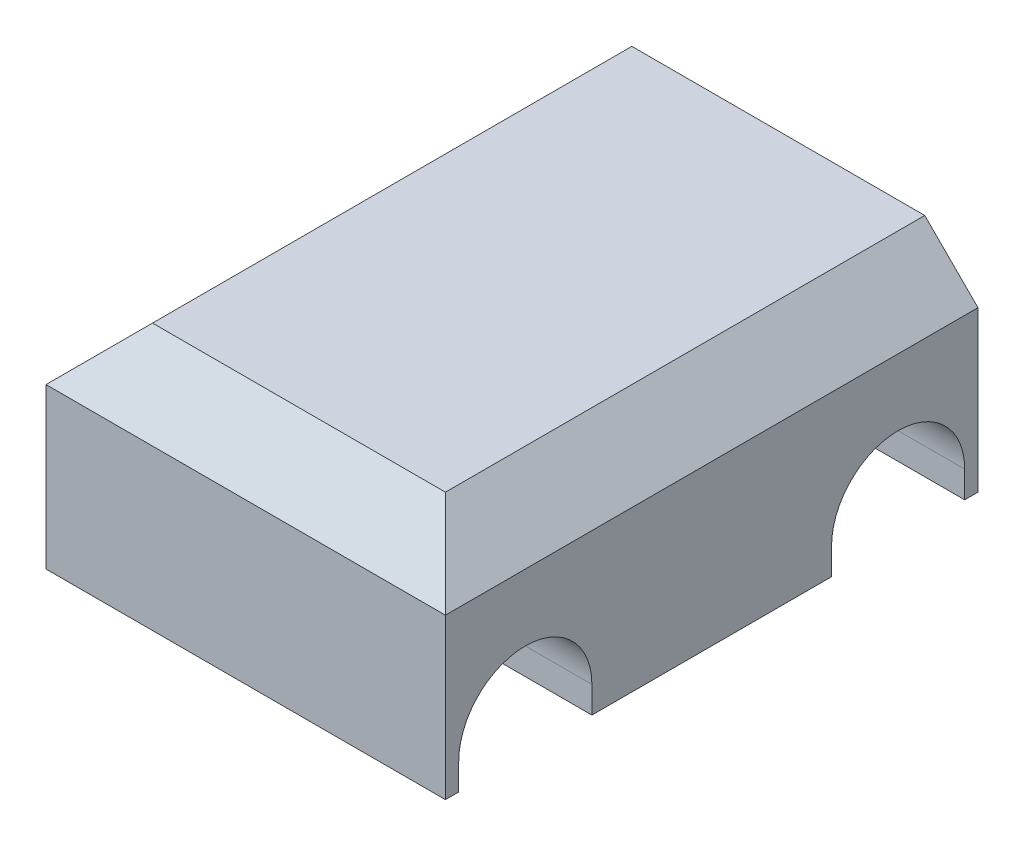
ISO-10303-21;
HEADER;
FILE_DESCRIPTION(('STEP AP214'),'2;1');
FILE_NAME('part.step','',(''),(''),'','','');
FILE_SCHEMA(('AUTOMOTIVE_DESIGN { 1 0 10303 214 1 1 1 1 }'));
ENDSEC;
DATA;
#1=APPLICATION_CONTEXT('core data for automotive mechanical design processes');
#2=APPLICATION_PROTOCOL_DEFINITION('international standard','automotive_design',2000,#1);
#3=PRODUCT_CONTEXT('',#1,'mechanical');
#4=PRODUCT('Part','Part','',(#3));
#5=PRODUCT_RELATED_PRODUCT_CATEGORY('part','',(#4));
#6=PRODUCT_DEFINITION_FORMATION('','',#4);
#7=PRODUCT_DEFINITION_CONTEXT('part definition',#1,'design');
#8=PRODUCT_DEFINITION('design','',#6,#7);
#9=PRODUCT_DEFINITION_SHAPE('','',#8);
#10=(LENGTH_UNIT() NAMED_UNIT(*) SI_UNIT(.MILLI.,.METRE.));
#11=(NAMED_UNIT(*) PLANE_ANGLE_UNIT() SI_UNIT($,.RADIAN.));
#12=(NAMED_UNIT(*) SI_UNIT($,.STERADIAN.) SOLID_ANGLE_UNIT());
#13=UNCERTAINTY_MEASURE_WITH_UNIT(LENGTH_MEASURE(1.E-05),#10,'distance_accuracy_value','');
#14=(GEOMETRIC_REPRESENTATION_CONTEXT(3) GLOBAL_UNCERTAINTY_ASSIGNED_CONTEXT((#13)) GLOBAL_UNIT_ASSIGNED_CONTEXT((#10,
#11,#12)) REPRESENTATION_CONTEXT('',''));
#15=CARTESIAN_POINT('',(0.,0.,0.));
#16=DIRECTION('',(0.,0.,1.));
#17=DIRECTION('',(1.,0.,0.));
#18=AXIS2_PLACEMENT_3D('',#15,#16,#17);
#19=CARTESIAN_POINT('',(0.,0.,0.));
#20=DIRECTION('',(0.,1.,0.));
#21=DIRECTION('',(0.,0.,1.));
#22=AXIS2_PLACEMENT_3D('',#19,#20,#21);
#23=PLANE('',#22);
#24=DIRECTION('',(1.,0.,0.));
#25=VECTOR('',#24,1.);
#26=CARTESIAN_POINT('',(0.,0.,45.));
#27=LINE('',#26,#25);
#28=CARTESIAN_POINT('',(40.,0.,45.));
#29=VERTEX_POINT('',#28);
#30=CARTESIAN_POINT('',(75.,0.,45.));
#31=VERTEX_POINT('',#30);
#32=EDGE_CURVE('E218',#29,#31,#27,.T.);
#33=ORIENTED_EDGE('',*,*,#32,.F.);
#34=DIRECTION('',(0.,0.,-1.));
#35=VECTOR('',#34,1.);
#36=CARTESIAN_POINT('',(40.,0.,0.));
#37=LINE('',#36,#35);
#38=CARTESIAN_POINT('',(40.,0.,95.));
#39=VERTEX_POINT('',#38);
#40=EDGE_CURVE('E202',#39,#29,#37,.T.);
#41=ORIENTED_EDGE('',*,*,#40,.F.);
#42=DIRECTION('',(1.,0.,0.));
#43=VECTOR('',#42,1.);
#44=CARTESIAN_POINT('',(0.,0.,95.));
#45=LINE('',#44,#43);
#46=CARTESIAN_POINT('',(75.,0.,95.));
#47=VERTEX_POINT('',#46);
#48=EDGE_CURVE('E214',#39,#47,#45,.T.);
#49=ORIENTED_EDGE('',*,*,#48,.T.);
#50=DIRECTION('',(0.,0.,-1.));
#51=VECTOR('',#50,1.);
#52=CARTESIAN_POINT('',(75.,0.,-100.));
#53=LINE('',#52,#51);
#54=CARTESIAN_POINT('',(75.,0.,100.));
#55=VERTEX_POINT('',#54);
#56=EDGE_CURVE('E291',#55,#47,#53,.T.);
#57=ORIENTED_EDGE('',*,*,#56,.F.);
#58=DIRECTION('',(1.,0.,0.));
#59=VECTOR('',#58,1.);
#60=CARTESIAN_POINT('',(-75.,0.,100.));
#61=LINE('',#60,#59);
#62=CARTESIAN_POINT('',(-75.,0.,100.));
#63=VERTEX_POINT('',#62);
#64=EDGE_CURVE('E290',#63,#55,#61,.T.);
#65=ORIENTED_EDGE('',*,*,#64,.F.);
#66=DIRECTION('',(0.,0.,1.));
#67=VECTOR('',#66,1.);
#68=CARTESIAN_POINT('',(-75.,0.,-100.));
#69=LINE('',#68,#67);
#70=CARTESIAN_POINT('',(-75.,0.,95.));
#71=VERTEX_POINT('',#70);
#72=EDGE_CURVE('E298',#71,#63,#69,.T.);
#73=ORIENTED_EDGE('',*,*,#72,.F.);
#74=DIRECTION('',(-1.,0.,0.));
#75=VECTOR('',#74,1.);
#76=CARTESIAN_POINT('',(0.,0.,95.));
#77=LINE('',#76,#75);
#78=CARTESIAN_POINT('',(-40.,0.,95.));
#79=VERTEX_POINT('',#78);
#80=EDGE_CURVE('E321',#79,#71,#77,.T.);
#81=ORIENTED_EDGE('',*,*,#80,.F.);
#82=DIRECTION('',(0.,0.,1.));
#83=VECTOR('',#82,1.);
#84=CARTESIAN_POINT('',(-40.,0.,0.));
#85=LINE('',#84,#83);
#86=CARTESIAN_POINT('',(-40.,0.,45.));
#87=VERTEX_POINT('',#86);
#88=EDGE_CURVE('E319',#87,#79,#85,.T.);
#89=ORIENTED_EDGE('',*,*,#88,.F.);
#90=DIRECTION('',(-1.,0.,0.));
#91=VECTOR('',#90,1.);
#92=CARTESIAN_POINT('',(0.,0.,45.));
#93=LINE('',#92,#91);
#94=CARTESIAN_POINT('',(-75.,0.,45.));
#95=VERTEX_POINT('',#94);
#96=EDGE_CURVE('E323',#87,#95,#93,.T.);
#97=ORIENTED_EDGE('',*,*,#96,.T.);
#98=CARTESIAN_POINT('',(-75.,0.,-45.));
#99=VERTEX_POINT('',#98);
#100=EDGE_CURVE('E302',#99,#95,#69,.T.);
#101=ORIENTED_EDGE('',*,*,#100,.F.);
#102=DIRECTION('',(-1.,0.,0.));
#103=VECTOR('',#102,1.);
#104=CARTESIAN_POINT('',(0.,0.,-45.));
#105=LINE('',#104,#103);
#106=CARTESIAN_POINT('',(-40.,0.,-45.));
#107=VERTEX_POINT('',#106);
#108=EDGE_CURVE('E317',#107,#99,#105,.T.);
#109=ORIENTED_EDGE('',*,*,#108,.F.);
#110=DIRECTION('',(0.,0.,1.));
#111=VECTOR('',#110,1.);
#112=CARTESIAN_POINT('',(-40.,0.,0.));
#113=LINE('',#112,#111);
#114=CARTESIAN_POINT('',(-40.,0.,-95.));
#115=VERTEX_POINT('',#114);
#116=EDGE_CURVE('E312',#115,#107,#113,.T.);
#117=ORIENTED_EDGE('',*,*,#116,.F.);
#118=DIRECTION('',(-1.,0.,0.));
#119=VECTOR('',#118,1.);
#120=CARTESIAN_POINT('',(0.,0.,-95.));
#121=LINE('',#120,#119);
#122=CARTESIAN_POINT('',(-75.,0.,-95.));
#123=VERTEX_POINT('',#122);
#124=EDGE_CURVE('E314',#115,#123,#121,.T.);
#125=ORIENTED_EDGE('',*,*,#124,.T.);
#126=CARTESIAN_POINT('',(-75.,0.,-100.));
#127=VERTEX_POINT('',#126);
#128=EDGE_CURVE('E299',#127,#123,#69,.T.);
#129=ORIENTED_EDGE('',*,*,#128,.F.);
#130=DIRECTION('',(-1.,0.,0.));
#131=VECTOR('',#130,1.);
#132=CARTESIAN_POINT('',(-75.,0.,-100.));
#133=LINE('',#132,#131);
#134=CARTESIAN_POINT('',(75.,0.,-100.));
#135=VERTEX_POINT('',#134);
#136=EDGE_CURVE('E294',#135,#127,#133,.T.);
#137=ORIENTED_EDGE('',*,*,#136,.F.);
#138=CARTESIAN_POINT('',(75.,0.,-95.));
#139=VERTEX_POINT('',#138);
#140=EDGE_CURVE('E284',#139,#135,#53,.T.);
#141=ORIENTED_EDGE('',*,*,#140,.F.);
#142=DIRECTION('',(1.,0.,0.));
#143=VECTOR('',#142,1.);
#144=CARTESIAN_POINT('',(0.,0.,-95.));
#145=LINE('',#144,#143);
#146=CARTESIAN_POINT('',(40.,0.,-95.));
#147=VERTEX_POINT('',#146);
#148=EDGE_CURVE('E240',#147,#139,#145,.T.);
#149=ORIENTED_EDGE('',*,*,#148,.F.);
#150=DIRECTION('',(0.,0.,-1.));
#151=VECTOR('',#150,1.);
#152=CARTESIAN_POINT('',(40.,0.,0.));
#153=LINE('',#152,#151);
#154=CARTESIAN_POINT('',(40.,0.,-45.));
#155=VERTEX_POINT('',#154);
#156=EDGE_CURVE('E326',#155,#147,#153,.T.);
#157=ORIENTED_EDGE('',*,*,#156,.F.);
#158=DIRECTION('',(1.,0.,0.));
#159=VECTOR('',#158,1.);
#160=CARTESIAN_POINT('',(0.,0.,-45.));
#161=LINE('',#160,#159);
#162=CARTESIAN_POINT('',(75.,0.,-45.));
#163=VERTEX_POINT('',#162);
#164=EDGE_CURVE('E243',#155,#163,#161,.T.);
#165=ORIENTED_EDGE('',*,*,#164,.T.);
#166=EDGE_CURVE('E295',#31,#163,#53,.T.);
#167=ORIENTED_EDGE('',*,*,#166,.F.);
#168=EDGE_LOOP('',(#33,#41,#49,#57,#65,#73,#81,#89,#97,#101,#109,#117,#125,#129,#137,#141,#149,
#157,#165,#167));
#169=FACE_BOUND('',#168,.T.);
#170=ADVANCED_FACE('F32',(#169),#23,.F.);
#171=CARTESIAN_POINT('',(75.,80.,-100.));
#172=DIRECTION('',(-1.,0.,0.));
#173=DIRECTION('',(0.,0.,1.));
#174=AXIS2_PLACEMENT_3D('',#171,#172,#173);
#175=PLANE('',#174);
#176=DIRECTION('',(0.,-1.,0.));
#177=VECTOR('',#176,1.);
#178=CARTESIAN_POINT('',(75.,80.,-100.));
#179=LINE('',#178,#177);
#180=CARTESIAN_POINT('',(75.,59.9999999999999,-100.));
#181=VERTEX_POINT('',#180);
#182=EDGE_CURVE('E310',#181,#135,#179,.T.);
#183=ORIENTED_EDGE('',*,*,#182,.F.);
#184=DIRECTION('',(0.,0.,1.));
#185=VECTOR('',#184,1.);
#186=CARTESIAN_POINT('',(75.,59.9999999999999,100.));
#187=LINE('',#186,#185);
#188=CARTESIAN_POINT('',(75.,59.9999999999999,100.));
#189=VERTEX_POINT('',#188);
#190=EDGE_CURVE('E56',#181,#189,#187,.T.);
#191=ORIENTED_EDGE('',*,*,#190,.T.);
#192=DIRECTION('',(0.,-1.,0.));
#193=VECTOR('',#192,1.);
#194=CARTESIAN_POINT('',(75.,80.,100.));
#195=LINE('',#194,#193);
#196=EDGE_CURVE('E289',#189,#55,#195,.T.);
#197=ORIENTED_EDGE('',*,*,#196,.T.);
#198=ORIENTED_EDGE('',*,*,#56,.T.);
#199=DIRECTION('',(0.,-1.,0.));
#200=VECTOR('',#199,1.);
#201=CARTESIAN_POINT('',(75.,0.,95.));
#202=LINE('',#201,#200);
#203=CARTESIAN_POINT('',(75.,10.,95.));
#204=VERTEX_POINT('',#203);
#205=EDGE_CURVE('E203',#204,#47,#202,.T.);
#206=ORIENTED_EDGE('',*,*,#205,.F.);
#207=CARTESIAN_POINT('',(75.,10.,70.));
#208=DIRECTION('',(1.,0.,0.));
#209=DIRECTION('',(0.,0.,-1.));
#210=AXIS2_PLACEMENT_3D('',#207,#208,#209);
#211=CIRCLE('',#210,25.);
#212=CARTESIAN_POINT('',(75.,10.,45.));
#213=VERTEX_POINT('',#212);
#214=EDGE_CURVE('E211',#213,#204,#211,.T.);
#215=ORIENTED_EDGE('',*,*,#214,.F.);
#216=DIRECTION('',(0.,-1.,0.));
#217=VECTOR('',#216,1.);
#218=CARTESIAN_POINT('',(75.,0.,45.));
#219=LINE('',#218,#217);
#220=EDGE_CURVE('E188',#213,#31,#219,.T.);
#221=ORIENTED_EDGE('',*,*,#220,.T.);
#222=ORIENTED_EDGE('',*,*,#166,.T.);
#223=DIRECTION('',(0.,-1.,0.));
#224=VECTOR('',#223,1.);
#225=CARTESIAN_POINT('',(75.,0.,-45.));
#226=LINE('',#225,#224);
#227=CARTESIAN_POINT('',(75.,10.,-45.));
#228=VERTEX_POINT('',#227);
#229=EDGE_CURVE('E220',#228,#163,#226,.T.);
#230=ORIENTED_EDGE('',*,*,#229,.F.);
#231=CARTESIAN_POINT('',(75.,10.,-70.));
#232=DIRECTION('',(-1.,0.,0.));
#233=DIRECTION('',(0.,0.,1.));
#234=AXIS2_PLACEMENT_3D('',#231,#232,#233);
#235=CIRCLE('',#234,25.);
#236=CARTESIAN_POINT('',(75.,10.,-95.));
#237=VERTEX_POINT('',#236);
#238=EDGE_CURVE('E225',#228,#237,#235,.T.);
#239=ORIENTED_EDGE('',*,*,#238,.T.);
#240=DIRECTION('',(0.,-1.,0.));
#241=VECTOR('',#240,1.);
#242=CARTESIAN_POINT('',(75.,0.,-95.));
#243=LINE('',#242,#241);
#244=EDGE_CURVE('E233',#237,#139,#243,.T.);
#245=ORIENTED_EDGE('',*,*,#244,.T.);
#246=ORIENTED_EDGE('',*,*,#140,.T.);
#247=EDGE_LOOP('',(#183,#191,#197,#198,#206,#215,#221,#222,#230,#239,#245,#246));
#248=FACE_BOUND('',#247,.T.);
#249=ADVANCED_FACE('F393',(#248),#175,.F.);
#250=CARTESIAN_POINT('',(-75.,80.,-100.));
#251=DIRECTION('',(1.,0.,0.));
#252=DIRECTION('',(0.,0.,-1.));
#253=AXIS2_PLACEMENT_3D('',#250,#251,#252);
#254=PLANE('',#253);
#255=DIRECTION('',(0.,-1.,0.));
#256=VECTOR('',#255,1.);
#257=CARTESIAN_POINT('',(-75.,80.,100.));
#258=LINE('',#257,#256);
#259=CARTESIAN_POINT('',(-75.,59.9999999999999,100.));
#260=VERTEX_POINT('',#259);
#261=EDGE_CURVE('E306',#260,#63,#258,.T.);
#262=ORIENTED_EDGE('',*,*,#261,.F.);
#263=DIRECTION('',(0.,0.,-1.));
#264=VECTOR('',#263,1.);
#265=CARTESIAN_POINT('',(-75.,59.9999999999999,-100.));
#266=LINE('',#265,#264);
#267=CARTESIAN_POINT('',(-75.,59.9999999999999,-100.));
#268=VERTEX_POINT('',#267);
#269=EDGE_CURVE('E11',#260,#268,#266,.T.);
#270=ORIENTED_EDGE('',*,*,#269,.T.);
#271=DIRECTION('',(0.,-1.,0.));
#272=VECTOR('',#271,1.);
#273=CARTESIAN_POINT('',(-75.,80.,-100.));
#274=LINE('',#273,#272);
#275=EDGE_CURVE('E308',#268,#127,#274,.T.);
#276=ORIENTED_EDGE('',*,*,#275,.T.);
#277=ORIENTED_EDGE('',*,*,#128,.T.);
#278=DIRECTION('',(0.,-1.,0.));
#279=VECTOR('',#278,1.);
#280=CARTESIAN_POINT('',(-75.,0.,-95.));
#281=LINE('',#280,#279);
#282=CARTESIAN_POINT('',(-75.,10.,-95.));
#283=VERTEX_POINT('',#282);
#284=EDGE_CURVE('E270',#283,#123,#281,.T.);
#285=ORIENTED_EDGE('',*,*,#284,.F.);
#286=CARTESIAN_POINT('',(-75.,10.,-70.));
#287=DIRECTION('',(-1.,0.,0.));
#288=DIRECTION('',(0.,0.,1.));
#289=AXIS2_PLACEMENT_3D('',#286,#287,#288);
#290=CIRCLE('',#289,25.);
#291=CARTESIAN_POINT('',(-75.,10.,-45.));
#292=VERTEX_POINT('',#291);
#293=EDGE_CURVE('E278',#292,#283,#290,.T.);
#294=ORIENTED_EDGE('',*,*,#293,.F.);
#295=DIRECTION('',(0.,-1.,0.));
#296=VECTOR('',#295,1.);
#297=CARTESIAN_POINT('',(-75.,0.,-45.));
#298=LINE('',#297,#296);
#299=EDGE_CURVE('E264',#292,#99,#298,.T.);
#300=ORIENTED_EDGE('',*,*,#299,.T.);
#301=ORIENTED_EDGE('',*,*,#100,.T.);
#302=DIRECTION('',(0.,-1.,0.));
#303=VECTOR('',#302,1.);
#304=CARTESIAN_POINT('',(-75.,0.,45.));
#305=LINE('',#304,#303);
#306=CARTESIAN_POINT('',(-75.,10.,45.));
#307=VERTEX_POINT('',#306);
#308=EDGE_CURVE('E246',#307,#95,#305,.T.);
#309=ORIENTED_EDGE('',*,*,#308,.F.);
#310=CARTESIAN_POINT('',(-75.,10.,70.));
#311=DIRECTION('',(1.,0.,0.));
#312=DIRECTION('',(0.,0.,-1.));
#313=AXIS2_PLACEMENT_3D('',#310,#311,#312);
#314=CIRCLE('',#313,25.);
#315=CARTESIAN_POINT('',(-75.,10.,95.));
#316=VERTEX_POINT('',#315);
#317=EDGE_CURVE('E250',#307,#316,#314,.T.);
#318=ORIENTED_EDGE('',*,*,#317,.T.);
#319=DIRECTION('',(0.,-1.,0.));
#320=VECTOR('',#319,1.);
#321=CARTESIAN_POINT('',(-75.,0.,95.));
#322=LINE('',#321,#320);
#323=EDGE_CURVE('E257',#316,#71,#322,.T.);
#324=ORIENTED_EDGE('',*,*,#323,.T.);
#325=ORIENTED_EDGE('',*,*,#72,.T.);
#326=EDGE_LOOP('',(#262,#270,#276,#277,#285,#294,#300,#301,#309,#318,#324,#325));
#327=FACE_BOUND('',#326,.T.);
#328=ADVANCED_FACE('F357',(#327),#254,.F.);
#329=CARTESIAN_POINT('',(-75.,80.,-100.));
#330=DIRECTION('',(0.,0.,1.));
#331=DIRECTION('',(1.,0.,0.));
#332=AXIS2_PLACEMENT_3D('',#329,#330,#331);
#333=PLANE('',#332);
#334=DIRECTION('',(-1.,0.,0.));
#335=VECTOR('',#334,1.);
#336=CARTESIAN_POINT('',(-75.,80.,-100.));
#337=LINE('',#336,#335);
#338=CARTESIAN_POINT('',(54.9999999999999,80.,-100.));
#339=VERTEX_POINT('',#338);
#340=CARTESIAN_POINT('',(-55.,80.,-100.));
#341=VERTEX_POINT('',#340);
#342=EDGE_CURVE('E286',#339,#341,#337,.T.);
#343=ORIENTED_EDGE('',*,*,#342,.F.);
#344=DIRECTION('',(0.707106781186546,-0.707106781186549,0.));
#345=VECTOR('',#344,1.);
#346=CARTESIAN_POINT('',(54.9999999999999,80.,-100.));
#347=LINE('',#346,#345);
#348=EDGE_CURVE('E338',#339,#181,#347,.T.);
#349=ORIENTED_EDGE('',*,*,#348,.T.);
#350=ORIENTED_EDGE('',*,*,#182,.T.);
#351=ORIENTED_EDGE('',*,*,#136,.T.);
#352=ORIENTED_EDGE('',*,*,#275,.F.);
#353=DIRECTION('',(0.707106781186546,0.707106781186549,0.));
#354=VECTOR('',#353,1.);
#355=CARTESIAN_POINT('',(-55.,80.,-100.));
#356=LINE('',#355,#354);
#357=EDGE_CURVE('E336',#268,#341,#356,.T.);
#358=ORIENTED_EDGE('',*,*,#357,.T.);
#359=EDGE_LOOP('',(#343,#349,#350,#351,#352,#358));
#360=FACE_BOUND('',#359,.T.);
#361=ADVANCED_FACE('F361',(#360),#333,.F.);
#362=CARTESIAN_POINT('',(-75.,80.,100.));
#363=DIRECTION('',(0.,0.,-1.));
#364=DIRECTION('',(-1.,0.,0.));
#365=AXIS2_PLACEMENT_3D('',#362,#363,#364);
#366=PLANE('',#365);
#367=ORIENTED_EDGE('',*,*,#196,.F.);
#368=DIRECTION('',(-1.,0.,0.));
#369=VECTOR('',#368,1.);
#370=CARTESIAN_POINT('',(-75.,59.9999999999999,100.));
#371=LINE('',#370,#369);
#372=EDGE_CURVE('E41',#189,#260,#371,.T.);
#373=ORIENTED_EDGE('',*,*,#372,.T.);
#374=ORIENTED_EDGE('',*,*,#261,.T.);
#375=ORIENTED_EDGE('',*,*,#64,.T.);
#376=EDGE_LOOP('',(#367,#373,#374,#375));
#377=FACE_BOUND('',#376,.T.);
#378=ADVANCED_FACE('F392',(#377),#366,.F.);
#379=CARTESIAN_POINT('',(0.,80.,0.));
#380=DIRECTION('',(0.,1.,0.));
#381=DIRECTION('',(0.,0.,1.));
#382=AXIS2_PLACEMENT_3D('',#379,#380,#381);
#383=PLANE('',#382);
#384=DIRECTION('',(1.,0.,0.));
#385=VECTOR('',#384,1.);
#386=CARTESIAN_POINT('',(75.,80.,80.));
#387=LINE('',#386,#385);
#388=CARTESIAN_POINT('',(-55.,80.,80.));
#389=VERTEX_POINT('',#388);
#390=CARTESIAN_POINT('',(54.9999999999999,80.,80.));
#391=VERTEX_POINT('',#390);
#392=EDGE_CURVE('E331',#389,#391,#387,.T.);
#393=ORIENTED_EDGE('',*,*,#392,.T.);
#394=DIRECTION('',(0.,0.,-1.));
#395=VECTOR('',#394,1.);
#396=CARTESIAN_POINT('',(54.9999999999999,80.,-100.));
#397=LINE('',#396,#395);
#398=EDGE_CURVE('E333',#391,#339,#397,.T.);
#399=ORIENTED_EDGE('',*,*,#398,.T.);
#400=ORIENTED_EDGE('',*,*,#342,.T.);
#401=DIRECTION('',(0.,0.,1.));
#402=VECTOR('',#401,1.);
#403=CARTESIAN_POINT('',(-55.,80.,100.));
#404=LINE('',#403,#402);
#405=EDGE_CURVE('E329',#341,#389,#404,.T.);
#406=ORIENTED_EDGE('',*,*,#405,.T.);
#407=EDGE_LOOP('',(#393,#399,#400,#406));
#408=FACE_BOUND('',#407,.T.);
#409=ADVANCED_FACE('F417',(#408),#383,.T.);
#410=CARTESIAN_POINT('',(-40.,0.,-45.));
#411=DIRECTION('',(0.,0.,-1.));
#412=DIRECTION('',(-1.,0.,0.));
#413=AXIS2_PLACEMENT_3D('',#410,#411,#412);
#414=PLANE('',#413);
#415=ORIENTED_EDGE('',*,*,#108,.T.);
#416=ORIENTED_EDGE('',*,*,#299,.F.);
#417=DIRECTION('',(-1.,0.,0.));
#418=VECTOR('',#417,1.);
#419=CARTESIAN_POINT('',(-40.,10.,-45.));
#420=LINE('',#419,#418);
#421=CARTESIAN_POINT('',(-40.,10.,-45.));
#422=VERTEX_POINT('',#421);
#423=EDGE_CURVE('E275',#422,#292,#420,.T.);
#424=ORIENTED_EDGE('',*,*,#423,.F.);
#425=DIRECTION('',(0.,-1.,0.));
#426=VECTOR('',#425,1.);
#427=CARTESIAN_POINT('',(-40.,0.,-45.));
#428=LINE('',#427,#426);
#429=EDGE_CURVE('E266',#422,#107,#428,.T.);
#430=ORIENTED_EDGE('',*,*,#429,.T.);
#431=EDGE_LOOP('',(#415,#416,#424,#430));
#432=FACE_BOUND('',#431,.T.);
#433=ADVANCED_FACE('F380',(#432),#414,.T.);
#434=CARTESIAN_POINT('',(-40.,0.,-95.));
#435=DIRECTION('',(0.,0.,-1.));
#436=DIRECTION('',(-1.,0.,0.));
#437=AXIS2_PLACEMENT_3D('',#434,#435,#436);
#438=PLANE('',#437);
#439=DIRECTION('',(0.,-1.,0.));
#440=VECTOR('',#439,1.);
#441=CARTESIAN_POINT('',(-40.,0.,-95.));
#442=LINE('',#441,#440);
#443=CARTESIAN_POINT('',(-40.,10.,-95.));
#444=VERTEX_POINT('',#443);
#445=EDGE_CURVE('E273',#444,#115,#442,.T.);
#446=ORIENTED_EDGE('',*,*,#445,.F.);
#447=DIRECTION('',(-1.,0.,0.));
#448=VECTOR('',#447,1.);
#449=CARTESIAN_POINT('',(-40.,10.,-95.));
#450=LINE('',#449,#448);
#451=EDGE_CURVE('E282',#444,#283,#450,.T.);
#452=ORIENTED_EDGE('',*,*,#451,.T.);
#453=ORIENTED_EDGE('',*,*,#284,.T.);
#454=ORIENTED_EDGE('',*,*,#124,.F.);
#455=EDGE_LOOP('',(#446,#452,#453,#454));
#456=FACE_BOUND('',#455,.T.);
#457=ADVANCED_FACE('F373',(#456),#438,.F.);
#458=CARTESIAN_POINT('',(-40.,0.,0.));
#459=DIRECTION('',(-1.,0.,0.));
#460=DIRECTION('',(0.,0.,1.));
#461=AXIS2_PLACEMENT_3D('',#458,#459,#460);
#462=PLANE('',#461);
#463=ORIENTED_EDGE('',*,*,#116,.T.);
#464=ORIENTED_EDGE('',*,*,#429,.F.);
#465=CARTESIAN_POINT('',(-40.,10.,-70.));
#466=DIRECTION('',(-1.,0.,0.));
#467=DIRECTION('',(0.,0.,1.));
#468=AXIS2_PLACEMENT_3D('',#465,#466,#467);
#469=CIRCLE('',#468,25.);
#470=EDGE_CURVE('E269',#422,#444,#469,.T.);
#471=ORIENTED_EDGE('',*,*,#470,.T.);
#472=ORIENTED_EDGE('',*,*,#445,.T.);
#473=EDGE_LOOP('',(#463,#464,#471,#472));
#474=FACE_BOUND('',#473,.T.);
#475=ADVANCED_FACE('F478',(#474),#462,.T.);
#476=CARTESIAN_POINT('',(-40.,10.,-70.));
#477=DIRECTION('',(-1.,0.,0.));
#478=DIRECTION('',(0.,0.,1.));
#479=AXIS2_PLACEMENT_3D('',#476,#477,#478);
#480=CYLINDRICAL_SURFACE('',#479,25.);
#481=ORIENTED_EDGE('',*,*,#293,.T.);
#482=ORIENTED_EDGE('',*,*,#451,.F.);
#483=ORIENTED_EDGE('',*,*,#470,.F.);
#484=ORIENTED_EDGE('',*,*,#423,.T.);
#485=EDGE_LOOP('',(#481,#482,#483,#484));
#486=FACE_BOUND('',#485,.T.);
#487=ADVANCED_FACE('F376',(#486),#480,.F.);
#488=CARTESIAN_POINT('',(-40.,0.,45.));
#489=DIRECTION('',(0.,0.,-1.));
#490=DIRECTION('',(-1.,0.,0.));
#491=AXIS2_PLACEMENT_3D('',#488,#489,#490);
#492=PLANE('',#491);
#493=DIRECTION('',(0.,-1.,0.));
#494=VECTOR('',#493,1.);
#495=CARTESIAN_POINT('',(-40.,0.,45.));
#496=LINE('',#495,#494);
#497=CARTESIAN_POINT('',(-40.,10.,45.));
#498=VERTEX_POINT('',#497);
#499=EDGE_CURVE('E247',#498,#87,#496,.T.);
#500=ORIENTED_EDGE('',*,*,#499,.F.);
#501=DIRECTION('',(-1.,0.,0.));
#502=VECTOR('',#501,1.);
#503=CARTESIAN_POINT('',(-40.,10.,45.));
#504=LINE('',#503,#502);
#505=EDGE_CURVE('E262',#498,#307,#504,.T.);
#506=ORIENTED_EDGE('',*,*,#505,.T.);
#507=ORIENTED_EDGE('',*,*,#308,.T.);
#508=ORIENTED_EDGE('',*,*,#96,.F.);
#509=EDGE_LOOP('',(#500,#506,#507,#508));
#510=FACE_BOUND('',#509,.T.);
#511=ADVANCED_FACE('F473',(#510),#492,.F.);
#512=CARTESIAN_POINT('',(-40.,0.,95.));
#513=DIRECTION('',(0.,0.,-1.));
#514=DIRECTION('',(-1.,0.,0.));
#515=AXIS2_PLACEMENT_3D('',#512,#513,#514);
#516=PLANE('',#515);
#517=ORIENTED_EDGE('',*,*,#80,.T.);
#518=ORIENTED_EDGE('',*,*,#323,.F.);
#519=DIRECTION('',(-1.,0.,0.));
#520=VECTOR('',#519,1.);
#521=CARTESIAN_POINT('',(-40.,10.,95.));
#522=LINE('',#521,#520);
#523=CARTESIAN_POINT('',(-40.,10.,95.));
#524=VERTEX_POINT('',#523);
#525=EDGE_CURVE('E255',#524,#316,#522,.T.);
#526=ORIENTED_EDGE('',*,*,#525,.F.);
#527=DIRECTION('',(0.,-1.,0.));
#528=VECTOR('',#527,1.);
#529=CARTESIAN_POINT('',(-40.,0.,95.));
#530=LINE('',#529,#528);
#531=EDGE_CURVE('E249',#524,#79,#530,.T.);
#532=ORIENTED_EDGE('',*,*,#531,.T.);
#533=EDGE_LOOP('',(#517,#518,#526,#532));
#534=FACE_BOUND('',#533,.T.);
#535=ADVANCED_FACE('F466',(#534),#516,.T.);
#536=CARTESIAN_POINT('',(-40.,0.,0.));
#537=DIRECTION('',(-1.,0.,0.));
#538=DIRECTION('',(0.,0.,-1.));
#539=AXIS2_PLACEMENT_3D('',#536,#537,#538);
#540=PLANE('',#539);
#541=ORIENTED_EDGE('',*,*,#88,.T.);
#542=ORIENTED_EDGE('',*,*,#531,.F.);
#543=CARTESIAN_POINT('',(-40.,10.,70.));
#544=DIRECTION('',(1.,0.,0.));
#545=DIRECTION('',(0.,0.,-1.));
#546=AXIS2_PLACEMENT_3D('',#543,#544,#545);
#547=CIRCLE('',#546,25.);
#548=EDGE_CURVE('E253',#498,#524,#547,.T.);
#549=ORIENTED_EDGE('',*,*,#548,.F.);
#550=ORIENTED_EDGE('',*,*,#499,.T.);
#551=EDGE_LOOP('',(#541,#542,#549,#550));
#552=FACE_BOUND('',#551,.T.);
#553=ADVANCED_FACE('F463',(#552),#540,.T.);
#554=CARTESIAN_POINT('',(-40.,10.,70.));
#555=DIRECTION('',(-1.,0.,0.));
#556=DIRECTION('',(0.,0.,1.));
#557=AXIS2_PLACEMENT_3D('',#554,#555,#556);
#558=CYLINDRICAL_SURFACE('',#557,25.);
#559=ORIENTED_EDGE('',*,*,#317,.F.);
#560=ORIENTED_EDGE('',*,*,#505,.F.);
#561=ORIENTED_EDGE('',*,*,#548,.T.);
#562=ORIENTED_EDGE('',*,*,#525,.T.);
#563=EDGE_LOOP('',(#559,#560,#561,#562));
#564=FACE_BOUND('',#563,.T.);
#565=ADVANCED_FACE('F456',(#564),#558,.F.);
#566=CARTESIAN_POINT('',(40.,0.,0.));
#567=DIRECTION('',(1.,0.,0.));
#568=DIRECTION('',(0.,0.,1.));
#569=AXIS2_PLACEMENT_3D('',#566,#567,#568);
#570=PLANE('',#569);
#571=ORIENTED_EDGE('',*,*,#156,.T.);
#572=DIRECTION('',(0.,-1.,0.));
#573=VECTOR('',#572,1.);
#574=CARTESIAN_POINT('',(40.,0.,-95.));
#575=LINE('',#574,#573);
#576=CARTESIAN_POINT('',(40.,10.,-95.));
#577=VERTEX_POINT('',#576);
#578=EDGE_CURVE('E224',#577,#147,#575,.T.);
#579=ORIENTED_EDGE('',*,*,#578,.F.);
#580=CARTESIAN_POINT('',(40.,10.,-70.));
#581=DIRECTION('',(-1.,0.,0.));
#582=DIRECTION('',(0.,0.,1.));
#583=AXIS2_PLACEMENT_3D('',#580,#581,#582);
#584=CIRCLE('',#583,25.);
#585=CARTESIAN_POINT('',(40.,10.,-45.));
#586=VERTEX_POINT('',#585);
#587=EDGE_CURVE('E228',#586,#577,#584,.T.);
#588=ORIENTED_EDGE('',*,*,#587,.F.);
#589=DIRECTION('',(0.,-1.,0.));
#590=VECTOR('',#589,1.);
#591=CARTESIAN_POINT('',(40.,0.,-45.));
#592=LINE('',#591,#590);
#593=EDGE_CURVE('E221',#586,#155,#592,.T.);
#594=ORIENTED_EDGE('',*,*,#593,.T.);
#595=EDGE_LOOP('',(#571,#579,#588,#594));
#596=FACE_BOUND('',#595,.T.);
#597=ADVANCED_FACE('F407',(#596),#570,.T.);
#598=CARTESIAN_POINT('',(40.,0.,-45.));
#599=DIRECTION('',(0.,0.,1.));
#600=DIRECTION('',(1.,0.,0.));
#601=AXIS2_PLACEMENT_3D('',#598,#599,#600);
#602=PLANE('',#601);
#603=ORIENTED_EDGE('',*,*,#593,.F.);
#604=DIRECTION('',(1.,0.,0.));
#605=VECTOR('',#604,1.);
#606=CARTESIAN_POINT('',(40.,10.,-45.));
#607=LINE('',#606,#605);
#608=EDGE_CURVE('E238',#586,#228,#607,.T.);
#609=ORIENTED_EDGE('',*,*,#608,.T.);
#610=ORIENTED_EDGE('',*,*,#229,.T.);
#611=ORIENTED_EDGE('',*,*,#164,.F.);
#612=EDGE_LOOP('',(#603,#609,#610,#611));
#613=FACE_BOUND('',#612,.T.);
#614=ADVANCED_FACE('F401',(#613),#602,.F.);
#615=CARTESIAN_POINT('',(40.,0.,-95.));
#616=DIRECTION('',(0.,0.,1.));
#617=DIRECTION('',(1.,0.,0.));
#618=AXIS2_PLACEMENT_3D('',#615,#616,#617);
#619=PLANE('',#618);
#620=ORIENTED_EDGE('',*,*,#148,.T.);
#621=ORIENTED_EDGE('',*,*,#244,.F.);
#622=DIRECTION('',(1.,0.,0.));
#623=VECTOR('',#622,1.);
#624=CARTESIAN_POINT('',(40.,10.,-95.));
#625=LINE('',#624,#623);
#626=EDGE_CURVE('E230',#577,#237,#625,.T.);
#627=ORIENTED_EDGE('',*,*,#626,.F.);
#628=ORIENTED_EDGE('',*,*,#578,.T.);
#629=EDGE_LOOP('',(#620,#621,#627,#628));
#630=FACE_BOUND('',#629,.T.);
#631=ADVANCED_FACE('F411',(#630),#619,.T.);
#632=CARTESIAN_POINT('',(40.,10.,-70.));
#633=DIRECTION('',(1.,0.,0.));
#634=DIRECTION('',(0.,0.,-1.));
#635=AXIS2_PLACEMENT_3D('',#632,#633,#634);
#636=CYLINDRICAL_SURFACE('',#635,25.);
#637=ORIENTED_EDGE('',*,*,#238,.F.);
#638=ORIENTED_EDGE('',*,*,#608,.F.);
#639=ORIENTED_EDGE('',*,*,#587,.T.);
#640=ORIENTED_EDGE('',*,*,#626,.T.);
#641=EDGE_LOOP('',(#637,#638,#639,#640));
#642=FACE_BOUND('',#641,.T.);
#643=ADVANCED_FACE('F414',(#642),#636,.F.);
#644=CARTESIAN_POINT('',(40.,0.,0.));
#645=DIRECTION('',(1.,0.,0.));
#646=DIRECTION('',(0.,0.,-1.));
#647=AXIS2_PLACEMENT_3D('',#644,#645,#646);
#648=PLANE('',#647);
#649=ORIENTED_EDGE('',*,*,#40,.T.);
#650=DIRECTION('',(0.,-1.,0.));
#651=VECTOR('',#650,1.);
#652=CARTESIAN_POINT('',(40.,0.,45.));
#653=LINE('',#652,#651);
#654=CARTESIAN_POINT('',(40.,10.,45.));
#655=VERTEX_POINT('',#654);
#656=EDGE_CURVE('E185',#655,#29,#653,.T.);
#657=ORIENTED_EDGE('',*,*,#656,.F.);
#658=CARTESIAN_POINT('',(40.,10.,70.));
#659=DIRECTION('',(1.,0.,0.));
#660=DIRECTION('',(0.,0.,-1.));
#661=AXIS2_PLACEMENT_3D('',#658,#659,#660);
#662=CIRCLE('',#661,25.);
#663=CARTESIAN_POINT('',(40.,10.,95.));
#664=VERTEX_POINT('',#663);
#665=EDGE_CURVE('E200',#655,#664,#662,.T.);
#666=ORIENTED_EDGE('',*,*,#665,.T.);
#667=DIRECTION('',(0.,-1.,0.));
#668=VECTOR('',#667,1.);
#669=CARTESIAN_POINT('',(40.,0.,95.));
#670=LINE('',#669,#668);
#671=EDGE_CURVE('E194',#664,#39,#670,.T.);
#672=ORIENTED_EDGE('',*,*,#671,.T.);
#673=EDGE_LOOP('',(#649,#657,#666,#672));
#674=FACE_BOUND('',#673,.T.);
#675=ADVANCED_FACE('F198',(#674),#648,.T.);
#676=CARTESIAN_POINT('',(40.,0.,45.));
#677=DIRECTION('',(0.,0.,1.));
#678=DIRECTION('',(1.,0.,0.));
#679=AXIS2_PLACEMENT_3D('',#676,#677,#678);
#680=PLANE('',#679);
#681=ORIENTED_EDGE('',*,*,#32,.T.);
#682=ORIENTED_EDGE('',*,*,#220,.F.);
#683=DIRECTION('',(1.,0.,0.));
#684=VECTOR('',#683,1.);
#685=CARTESIAN_POINT('',(40.,10.,45.));
#686=LINE('',#685,#684);
#687=EDGE_CURVE('E182',#655,#213,#686,.T.);
#688=ORIENTED_EDGE('',*,*,#687,.F.);
#689=ORIENTED_EDGE('',*,*,#656,.T.);
#690=EDGE_LOOP('',(#681,#682,#688,#689));
#691=FACE_BOUND('',#690,.T.);
#692=ADVANCED_FACE('F184',(#691),#680,.T.);
#693=CARTESIAN_POINT('',(40.,0.,95.));
#694=DIRECTION('',(0.,0.,1.));
#695=DIRECTION('',(1.,0.,0.));
#696=AXIS2_PLACEMENT_3D('',#693,#694,#695);
#697=PLANE('',#696);
#698=ORIENTED_EDGE('',*,*,#671,.F.);
#699=DIRECTION('',(1.,0.,0.));
#700=VECTOR('',#699,1.);
#701=CARTESIAN_POINT('',(40.,10.,95.));
#702=LINE('',#701,#700);
#703=EDGE_CURVE('E193',#664,#204,#702,.T.);
#704=ORIENTED_EDGE('',*,*,#703,.T.);
#705=ORIENTED_EDGE('',*,*,#205,.T.);
#706=ORIENTED_EDGE('',*,*,#48,.F.);
#707=EDGE_LOOP('',(#698,#704,#705,#706));
#708=FACE_BOUND('',#707,.T.);
#709=ADVANCED_FACE('F396',(#708),#697,.F.);
#710=CARTESIAN_POINT('',(40.,10.,70.));
#711=DIRECTION('',(1.,0.,0.));
#712=DIRECTION('',(0.,0.,-1.));
#713=AXIS2_PLACEMENT_3D('',#710,#711,#712);
#714=CYLINDRICAL_SURFACE('',#713,25.);
#715=ORIENTED_EDGE('',*,*,#214,.T.);
#716=ORIENTED_EDGE('',*,*,#703,.F.);
#717=ORIENTED_EDGE('',*,*,#665,.F.);
#718=ORIENTED_EDGE('',*,*,#687,.T.);
#719=EDGE_LOOP('',(#715,#716,#717,#718));
#720=FACE_BOUND('',#719,.T.);
#721=ADVANCED_FACE('F205',(#720),#714,.F.);
#722=CARTESIAN_POINT('',(-55.,80.,0.));
#723=DIRECTION('',(-0.707106781186549,0.707106781186546,0.));
#724=DIRECTION('',(0.,0.,-1.));
#725=AXIS2_PLACEMENT_3D('',#722,#723,#724);
#726=PLANE('',#725);
#727=ORIENTED_EDGE('',*,*,#357,.F.);
#728=ORIENTED_EDGE('',*,*,#269,.F.);
#729=DIRECTION('',(0.577350269189625,0.577350269189627,-0.577350269189625));
#730=VECTOR('',#729,1.);
#731=CARTESIAN_POINT('',(-28.3333333333334,106.666666666667,53.3333333333334));
#732=LINE('',#731,#730);
#733=EDGE_CURVE('E36',#389,#260,#732,.F.);
#734=ORIENTED_EDGE('',*,*,#733,.F.);
#735=ORIENTED_EDGE('',*,*,#405,.F.);
#736=EDGE_LOOP('',(#727,#728,#734,#735));
#737=FACE_BOUND('',#736,.T.);
#738=ADVANCED_FACE('F34',(#737),#726,.T.);
#739=CARTESIAN_POINT('',(0.,80.,80.));
#740=DIRECTION('',(0.,0.707106781186546,0.707106781186549));
#741=DIRECTION('',(-1.,0.,0.));
#742=AXIS2_PLACEMENT_3D('',#739,#740,#741);
#743=PLANE('',#742);
#744=ORIENTED_EDGE('',*,*,#733,.T.);
#745=ORIENTED_EDGE('',*,*,#372,.F.);
#746=DIRECTION('',(-0.577350269189625,0.577350269189627,-0.577350269189625));
#747=VECTOR('',#746,1.);
#748=CARTESIAN_POINT('',(36.6666666666667,98.3333333333333,61.6666666666667));
#749=LINE('',#748,#747);
#750=EDGE_CURVE('E341',#391,#189,#749,.F.);
#751=ORIENTED_EDGE('',*,*,#750,.F.);
#752=ORIENTED_EDGE('',*,*,#392,.F.);
#753=EDGE_LOOP('',(#744,#745,#751,#752));
#754=FACE_BOUND('',#753,.T.);
#755=ADVANCED_FACE('F350',(#754),#743,.T.);
#756=CARTESIAN_POINT('',(54.9999999999999,80.,0.));
#757=DIRECTION('',(0.707106781186549,0.707106781186546,0.));
#758=DIRECTION('',(0.,0.,1.));
#759=AXIS2_PLACEMENT_3D('',#756,#757,#758);
#760=PLANE('',#759);
#761=ORIENTED_EDGE('',*,*,#750,.T.);
#762=ORIENTED_EDGE('',*,*,#190,.F.);
#763=ORIENTED_EDGE('',*,*,#348,.F.);
#764=ORIENTED_EDGE('',*,*,#398,.F.);
#765=EDGE_LOOP('',(#761,#762,#763,#764));
#766=FACE_BOUND('',#765,.T.);
#767=ADVANCED_FACE('F415',(#766),#760,.T.);
#768=CLOSED_SHELL('',(#170,#249,#328,#361,#378,#409,#433,#457,#475,#487,#511,#535,#553,#565,
#597,#614,#631,#643,#675,#692,#709,#721,#738,#755,#767));
#769=MANIFOLD_SOLID_BREP('B2',#768);
#770=ADVANCED_BREP_SHAPE_REPRESENTATION('',(#18,#769),#14);
#771=SHAPE_DEFINITION_REPRESENTATION(#9,#770);
ENDSEC;
END-ISO-10303-21;
